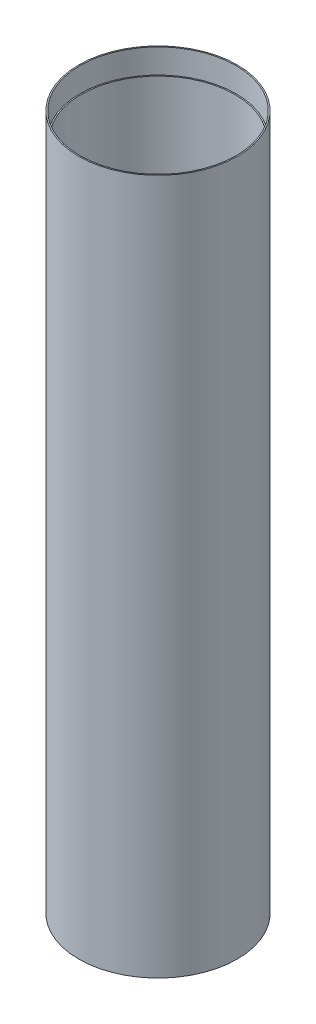
ISO-10303-21;
HEADER;
FILE_DESCRIPTION(('STEP AP214'),'2;1');
FILE_NAME('part.step','',(''),(''),'','','');
FILE_SCHEMA(('AUTOMOTIVE_DESIGN { 1 0 10303 214 1 1 1 1 }'));
ENDSEC;
DATA;
#1=APPLICATION_CONTEXT('core data for automotive mechanical design processes');
#2=APPLICATION_PROTOCOL_DEFINITION('international standard','automotive_design',2000,#1);
#3=PRODUCT_CONTEXT('',#1,'mechanical');
#4=PRODUCT('Part','Part','',(#3));
#5=PRODUCT_RELATED_PRODUCT_CATEGORY('part','',(#4));
#6=PRODUCT_DEFINITION_FORMATION('','',#4);
#7=PRODUCT_DEFINITION_CONTEXT('part definition',#1,'design');
#8=PRODUCT_DEFINITION('design','',#6,#7);
#9=PRODUCT_DEFINITION_SHAPE('','',#8);
#10=(LENGTH_UNIT() NAMED_UNIT(*) SI_UNIT(.MILLI.,.METRE.));
#11=(NAMED_UNIT(*) PLANE_ANGLE_UNIT() SI_UNIT($,.RADIAN.));
#12=(NAMED_UNIT(*) SI_UNIT($,.STERADIAN.) SOLID_ANGLE_UNIT());
#13=UNCERTAINTY_MEASURE_WITH_UNIT(LENGTH_MEASURE(1.E-05),#10,'distance_accuracy_value','');
#14=(GEOMETRIC_REPRESENTATION_CONTEXT(3) GLOBAL_UNCERTAINTY_ASSIGNED_CONTEXT((#13)) GLOBAL_UNIT_ASSIGNED_CONTEXT((#10,
#11,#12)) REPRESENTATION_CONTEXT('',''));
#15=CARTESIAN_POINT('',(0.,0.,0.));
#16=DIRECTION('',(0.,0.,1.));
#17=DIRECTION('',(1.,0.,0.));
#18=AXIS2_PLACEMENT_3D('',#15,#16,#17);
#19=CARTESIAN_POINT('',(0.,0.,0.));
#20=DIRECTION('',(0.,-1.,0.));
#21=DIRECTION('',(0.,0.,-1.));
#22=AXIS2_PLACEMENT_3D('',#19,#20,#21);
#23=CYLINDRICAL_SURFACE('',#22,64.);
#24=CARTESIAN_POINT('',(0.,265.,0.));
#25=DIRECTION('',(0.,-1.,0.));
#26=DIRECTION('',(0.,0.,-1.));
#27=AXIS2_PLACEMENT_3D('',#24,#25,#26);
#28=CIRCLE('',#27,64.);
#29=CARTESIAN_POINT('',(0.,265.,-64.));
#30=VERTEX_POINT('',#29);
#31=EDGE_CURVE('E87',#30,#30,#28,.T.);
#32=ORIENTED_EDGE('',*,*,#31,.T.);
#33=EDGE_LOOP('',(#32));
#34=FACE_BOUND('',#33,.T.);
#35=CARTESIAN_POINT('',(0.,285.,0.));
#36=DIRECTION('',(0.,-1.,0.));
#37=DIRECTION('',(0.,0.,-1.));
#38=AXIS2_PLACEMENT_3D('',#35,#36,#37);
#39=CIRCLE('',#38,64.);
#40=CARTESIAN_POINT('',(0.,285.,-64.));
#41=VERTEX_POINT('',#40);
#42=EDGE_CURVE('E10',#41,#41,#39,.T.);
#43=ORIENTED_EDGE('',*,*,#42,.F.);
#44=EDGE_LOOP('',(#43));
#45=FACE_BOUND('',#44,.T.);
#46=ADVANCED_FACE('F50',(#34,#45),#23,.F.);
#47=CARTESIAN_POINT('',(64.,285.,0.));
#48=DIRECTION('',(0.,1.,0.));
#49=DIRECTION('',(0.,0.,1.));
#50=AXIS2_PLACEMENT_3D('',#47,#48,#49);
#51=PLANE('',#50);
#52=ORIENTED_EDGE('',*,*,#42,.T.);
#53=EDGE_LOOP('',(#52));
#54=FACE_BOUND('',#53,.T.);
#55=CARTESIAN_POINT('',(0.,285.,0.));
#56=DIRECTION('',(0.,-1.,0.));
#57=DIRECTION('',(0.,0.,-1.));
#58=AXIS2_PLACEMENT_3D('',#55,#56,#57);
#59=CIRCLE('',#58,65.);
#60=CARTESIAN_POINT('',(0.,285.,-65.));
#61=VERTEX_POINT('',#60);
#62=EDGE_CURVE('E57',#61,#61,#59,.T.);
#63=ORIENTED_EDGE('',*,*,#62,.F.);
#64=EDGE_LOOP('',(#63));
#65=FACE_BOUND('',#64,.T.);
#66=ADVANCED_FACE('F107',(#54,#65),#51,.T.);
#67=CARTESIAN_POINT('',(0.,0.,0.));
#68=DIRECTION('',(0.,-1.,0.));
#69=DIRECTION('',(0.,0.,-1.));
#70=AXIS2_PLACEMENT_3D('',#67,#68,#69);
#71=CYLINDRICAL_SURFACE('',#70,65.);
#72=ORIENTED_EDGE('',*,*,#62,.T.);
#73=EDGE_LOOP('',(#72));
#74=FACE_BOUND('',#73,.T.);
#75=CARTESIAN_POINT('',(0.,-285.,0.));
#76=DIRECTION('',(0.,-1.,0.));
#77=DIRECTION('',(0.,0.,-1.));
#78=AXIS2_PLACEMENT_3D('',#75,#76,#77);
#79=CIRCLE('',#78,65.0000000000001);
#80=CARTESIAN_POINT('',(0.,-285.,-65.0000000000001));
#81=VERTEX_POINT('',#80);
#82=EDGE_CURVE('E63',#81,#81,#79,.T.);
#83=ORIENTED_EDGE('',*,*,#82,.F.);
#84=EDGE_LOOP('',(#83));
#85=FACE_BOUND('',#84,.T.);
#86=ADVANCED_FACE('F111',(#74,#85),#71,.T.);
#87=CARTESIAN_POINT('',(65.0000000000001,-285.,0.));
#88=DIRECTION('',(0.,-1.,0.));
#89=DIRECTION('',(0.,0.,-1.));
#90=AXIS2_PLACEMENT_3D('',#87,#88,#89);
#91=PLANE('',#90);
#92=ORIENTED_EDGE('',*,*,#82,.T.);
#93=EDGE_LOOP('',(#92));
#94=FACE_BOUND('',#93,.T.);
#95=CARTESIAN_POINT('',(0.,-285.,0.));
#96=DIRECTION('',(0.,-1.,0.));
#97=DIRECTION('',(0.,0.,-1.));
#98=AXIS2_PLACEMENT_3D('',#95,#96,#97);
#99=CIRCLE('',#98,64.0000000000001);
#100=CARTESIAN_POINT('',(0.,-285.,-64.0000000000001));
#101=VERTEX_POINT('',#100);
#102=EDGE_CURVE('E69',#101,#101,#99,.T.);
#103=ORIENTED_EDGE('',*,*,#102,.F.);
#104=EDGE_LOOP('',(#103));
#105=FACE_BOUND('',#104,.T.);
#106=ADVANCED_FACE('F115',(#94,#105),#91,.T.);
#107=CARTESIAN_POINT('',(0.,0.,0.));
#108=DIRECTION('',(0.,-1.,0.));
#109=DIRECTION('',(0.,0.,-1.));
#110=AXIS2_PLACEMENT_3D('',#107,#108,#109);
#111=CYLINDRICAL_SURFACE('',#110,64.0000000000001);
#112=ORIENTED_EDGE('',*,*,#102,.T.);
#113=EDGE_LOOP('',(#112));
#114=FACE_BOUND('',#113,.T.);
#115=CARTESIAN_POINT('',(0.,-265.,0.));
#116=DIRECTION('',(0.,-1.,0.));
#117=DIRECTION('',(0.,0.,-1.));
#118=AXIS2_PLACEMENT_3D('',#115,#116,#117);
#119=CIRCLE('',#118,64.0000000000001);
#120=CARTESIAN_POINT('',(0.,-265.,-64.0000000000001));
#121=VERTEX_POINT('',#120);
#122=EDGE_CURVE('E75',#121,#121,#119,.T.);
#123=ORIENTED_EDGE('',*,*,#122,.F.);
#124=EDGE_LOOP('',(#123));
#125=FACE_BOUND('',#124,.T.);
#126=ADVANCED_FACE('F121',(#114,#125),#111,.F.);
#127=CARTESIAN_POINT('',(64.0000000000001,-265.,0.));
#128=DIRECTION('',(0.,-1.,0.));
#129=DIRECTION('',(0.,0.,-1.));
#130=AXIS2_PLACEMENT_3D('',#127,#128,#129);
#131=PLANE('',#130);
#132=ORIENTED_EDGE('',*,*,#122,.T.);
#133=EDGE_LOOP('',(#132));
#134=FACE_BOUND('',#133,.T.);
#135=CARTESIAN_POINT('',(0.,-265.,0.));
#136=DIRECTION('',(0.,-1.,0.));
#137=DIRECTION('',(0.,0.,-1.));
#138=AXIS2_PLACEMENT_3D('',#135,#136,#137);
#139=CIRCLE('',#138,63.);
#140=CARTESIAN_POINT('',(0.,-265.,-63.));
#141=VERTEX_POINT('',#140);
#142=EDGE_CURVE('E79',#141,#141,#139,.T.);
#143=ORIENTED_EDGE('',*,*,#142,.F.);
#144=EDGE_LOOP('',(#143));
#145=FACE_BOUND('',#144,.T.);
#146=ADVANCED_FACE('F103',(#134,#145),#131,.T.);
#147=CARTESIAN_POINT('',(0.,0.,0.));
#148=DIRECTION('',(0.,-1.,0.));
#149=DIRECTION('',(0.,0.,-1.));
#150=AXIS2_PLACEMENT_3D('',#147,#148,#149);
#151=CYLINDRICAL_SURFACE('',#150,63.);
#152=ORIENTED_EDGE('',*,*,#142,.T.);
#153=EDGE_LOOP('',(#152));
#154=FACE_BOUND('',#153,.T.);
#155=CARTESIAN_POINT('',(0.,265.,0.));
#156=DIRECTION('',(0.,-1.,0.));
#157=DIRECTION('',(0.,0.,-1.));
#158=AXIS2_PLACEMENT_3D('',#155,#156,#157);
#159=CIRCLE('',#158,63.);
#160=CARTESIAN_POINT('',(0.,265.,-63.));
#161=VERTEX_POINT('',#160);
#162=EDGE_CURVE('E83',#161,#161,#159,.T.);
#163=ORIENTED_EDGE('',*,*,#162,.F.);
#164=EDGE_LOOP('',(#163));
#165=FACE_BOUND('',#164,.T.);
#166=ADVANCED_FACE('F97',(#154,#165),#151,.F.);
#167=CARTESIAN_POINT('',(63.,265.,0.));
#168=DIRECTION('',(0.,1.,0.));
#169=DIRECTION('',(0.,0.,1.));
#170=AXIS2_PLACEMENT_3D('',#167,#168,#169);
#171=PLANE('',#170);
#172=ORIENTED_EDGE('',*,*,#162,.T.);
#173=EDGE_LOOP('',(#172));
#174=FACE_BOUND('',#173,.T.);
#175=ORIENTED_EDGE('',*,*,#31,.F.);
#176=EDGE_LOOP('',(#175));
#177=FACE_BOUND('',#176,.T.);
#178=ADVANCED_FACE('F95',(#174,#177),#171,.T.);
#179=CLOSED_SHELL('',(#46,#66,#86,#106,#126,#146,#166,#178));
#180=MANIFOLD_SOLID_BREP('B2',#179);
#181=ADVANCED_BREP_SHAPE_REPRESENTATION('',(#18,#180),#14);
#182=SHAPE_DEFINITION_REPRESENTATION(#9,#181);
ENDSEC;
END-ISO-10303-21;
